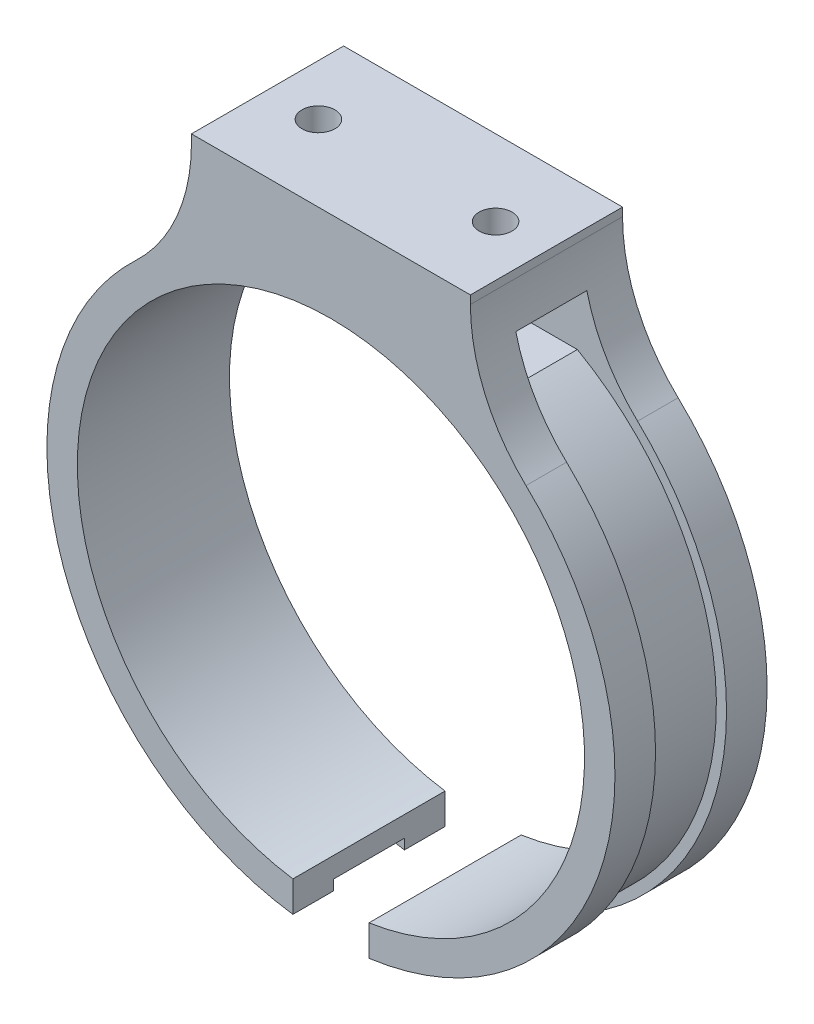
ISO-10303-21;
HEADER;
FILE_DESCRIPTION(('STEP AP214'),'2;1');
FILE_NAME('part.step','',(''),(''),'','','');
FILE_SCHEMA(('AUTOMOTIVE_DESIGN { 1 0 10303 214 1 1 1 1 }'));
ENDSEC;
DATA;
#1=APPLICATION_CONTEXT('core data for automotive mechanical design processes');
#2=APPLICATION_PROTOCOL_DEFINITION('international standard','automotive_design',2000,#1);
#3=PRODUCT_CONTEXT('',#1,'mechanical');
#4=PRODUCT('Part','Part','',(#3));
#5=PRODUCT_RELATED_PRODUCT_CATEGORY('part','',(#4));
#6=PRODUCT_DEFINITION_FORMATION('','',#4);
#7=PRODUCT_DEFINITION_CONTEXT('part definition',#1,'design');
#8=PRODUCT_DEFINITION('design','',#6,#7);
#9=PRODUCT_DEFINITION_SHAPE('','',#8);
#10=(LENGTH_UNIT() NAMED_UNIT(*) SI_UNIT(.MILLI.,.METRE.));
#11=(NAMED_UNIT(*) PLANE_ANGLE_UNIT() SI_UNIT($,.RADIAN.));
#12=(NAMED_UNIT(*) SI_UNIT($,.STERADIAN.) SOLID_ANGLE_UNIT());
#13=UNCERTAINTY_MEASURE_WITH_UNIT(LENGTH_MEASURE(1.E-05),#10,'distance_accuracy_value','');
#14=(GEOMETRIC_REPRESENTATION_CONTEXT(3) GLOBAL_UNCERTAINTY_ASSIGNED_CONTEXT((#13)) GLOBAL_UNIT_ASSIGNED_CONTEXT((#10,
#11,#12)) REPRESENTATION_CONTEXT('',''));
#15=CARTESIAN_POINT('',(0.,0.,0.));
#16=DIRECTION('',(0.,0.,1.));
#17=DIRECTION('',(1.,0.,0.));
#18=AXIS2_PLACEMENT_3D('',#15,#16,#17);
#19=CARTESIAN_POINT('',(0.,0.,-7.));
#20=DIRECTION('',(0.,0.,1.));
#21=DIRECTION('',(1.,0.,0.));
#22=AXIS2_PLACEMENT_3D('',#19,#20,#21);
#23=CYLINDRICAL_SURFACE('',#22,54.);
#24=DIRECTION('',(0.,0.,1.));
#25=VECTOR('',#24,1.);
#26=CARTESIAN_POINT('',(26.5894716006167,47.,-7.));
#27=LINE('',#26,#25);
#28=CARTESIAN_POINT('',(26.5894716006167,47.,7.));
#29=VERTEX_POINT('',#28);
#30=CARTESIAN_POINT('',(26.5894716006167,47.,-7.));
#31=VERTEX_POINT('',#30);
#32=EDGE_CURVE('E11',#29,#31,#27,.F.);
#33=ORIENTED_EDGE('',*,*,#32,.F.);
#34=CARTESIAN_POINT('',(0.,0.,7.));
#35=DIRECTION('',(0.,0.,1.));
#36=DIRECTION('',(1.,0.,0.));
#37=AXIS2_PLACEMENT_3D('',#34,#35,#36);
#38=CIRCLE('',#37,54.);
#39=CARTESIAN_POINT('',(7.5,-53.4766304099277,7.));
#40=VERTEX_POINT('',#39);
#41=EDGE_CURVE('E275',#40,#29,#38,.T.);
#42=ORIENTED_EDGE('',*,*,#41,.F.);
#43=DIRECTION('',(0.,0.,1.));
#44=VECTOR('',#43,1.);
#45=CARTESIAN_POINT('',(7.5,-53.4766304099277,-7.));
#46=LINE('',#45,#44);
#47=CARTESIAN_POINT('',(7.5,-53.4766304099277,-7.));
#48=VERTEX_POINT('',#47);
#49=EDGE_CURVE('E342',#48,#40,#46,.T.);
#50=ORIENTED_EDGE('',*,*,#49,.F.);
#51=CARTESIAN_POINT('',(0.,0.,-7.));
#52=DIRECTION('',(0.,0.,1.));
#53=DIRECTION('',(1.,0.,0.));
#54=AXIS2_PLACEMENT_3D('',#51,#52,#53);
#55=CIRCLE('',#54,54.);
#56=EDGE_CURVE('E270',#48,#31,#55,.T.);
#57=ORIENTED_EDGE('',*,*,#56,.T.);
#58=EDGE_LOOP('',(#33,#42,#50,#57));
#59=FACE_BOUND('',#58,.T.);
#60=ADVANCED_FACE('F35',(#59),#23,.T.);
#61=CARTESIAN_POINT('',(0.,0.,15.));
#62=DIRECTION('',(0.,0.,-1.));
#63=DIRECTION('',(-1.,0.,0.));
#64=AXIS2_PLACEMENT_3D('',#61,#62,#63);
#65=CYLINDRICAL_SURFACE('',#64,56.);
#66=CARTESIAN_POINT('',(0.,0.,-15.));
#67=DIRECTION('',(0.,0.,1.));
#68=DIRECTION('',(1.,0.,0.));
#69=AXIS2_PLACEMENT_3D('',#66,#67,#68);
#70=CIRCLE('',#69,56.);
#71=CARTESIAN_POINT('',(-38.4615384615385,40.7027033398471,-15.));
#72=VERTEX_POINT('',#71);
#73=CARTESIAN_POINT('',(-7.5,-55.4954953126828,-15.));
#74=VERTEX_POINT('',#73);
#75=EDGE_CURVE('E319',#72,#74,#70,.T.);
#76=ORIENTED_EDGE('',*,*,#75,.T.);
#77=DIRECTION('',(0.,0.,-1.));
#78=VECTOR('',#77,1.);
#79=CARTESIAN_POINT('',(-7.5,-55.4954953126828,15.));
#80=LINE('',#79,#78);
#81=CARTESIAN_POINT('',(-7.5,-55.4954953126828,-7.));
#82=VERTEX_POINT('',#81);
#83=EDGE_CURVE('E258',#74,#82,#80,.F.);
#84=ORIENTED_EDGE('',*,*,#83,.T.);
#85=CARTESIAN_POINT('',(0.,0.,-7.));
#86=DIRECTION('',(0.,0.,1.));
#87=DIRECTION('',(1.,0.,0.));
#88=AXIS2_PLACEMENT_3D('',#85,#86,#87);
#89=CIRCLE('',#88,56.);
#90=CARTESIAN_POINT('',(-38.4615384615385,40.7027033398471,-7.));
#91=VERTEX_POINT('',#90);
#92=EDGE_CURVE('E281',#91,#82,#89,.T.);
#93=ORIENTED_EDGE('',*,*,#92,.F.);
#94=DIRECTION('',(0.,0.,-1.));
#95=VECTOR('',#94,1.);
#96=CARTESIAN_POINT('',(-38.4615384615385,40.7027033398471,15.));
#97=LINE('',#96,#95);
#98=EDGE_CURVE('E324',#91,#72,#97,.T.);
#99=ORIENTED_EDGE('',*,*,#98,.T.);
#100=EDGE_LOOP('',(#76,#84,#93,#99));
#101=FACE_BOUND('',#100,.T.);
#102=ADVANCED_FACE('F369',(#101),#65,.T.);
#103=CARTESIAN_POINT('',(0.,0.,7.));
#104=DIRECTION('',(0.,0.,1.));
#105=DIRECTION('',(1.,0.,0.));
#106=AXIS2_PLACEMENT_3D('',#103,#104,#105);
#107=CIRCLE('',#106,56.);
#108=CARTESIAN_POINT('',(-38.4615384615385,40.7027033398471,7.));
#109=VERTEX_POINT('',#108);
#110=CARTESIAN_POINT('',(-7.5,-55.4954953126828,7.));
#111=VERTEX_POINT('',#110);
#112=EDGE_CURVE('E191',#109,#111,#107,.T.);
#113=ORIENTED_EDGE('',*,*,#112,.T.);
#114=DIRECTION('',(0.,0.,-1.));
#115=VECTOR('',#114,1.);
#116=CARTESIAN_POINT('',(-7.5,-55.4954953126828,15.));
#117=LINE('',#116,#115);
#118=CARTESIAN_POINT('',(-7.5,-55.4954953126828,15.));
#119=VERTEX_POINT('',#118);
#120=EDGE_CURVE('E255',#111,#119,#117,.F.);
#121=ORIENTED_EDGE('',*,*,#120,.T.);
#122=CARTESIAN_POINT('',(0.,0.,15.));
#123=DIRECTION('',(0.,0.,1.));
#124=DIRECTION('',(1.,0.,0.));
#125=AXIS2_PLACEMENT_3D('',#122,#123,#124);
#126=CIRCLE('',#125,56.);
#127=CARTESIAN_POINT('',(-38.4615384615385,40.7027033398471,15.));
#128=VERTEX_POINT('',#127);
#129=EDGE_CURVE('E314',#128,#119,#126,.T.);
#130=ORIENTED_EDGE('',*,*,#129,.F.);
#131=EDGE_CURVE('E325',#128,#109,#97,.T.);
#132=ORIENTED_EDGE('',*,*,#131,.T.);
#133=EDGE_LOOP('',(#113,#121,#130,#132));
#134=FACE_BOUND('',#133,.T.);
#135=ADVANCED_FACE('F390',(#134),#65,.T.);
#136=CARTESIAN_POINT('',(7.5,-55.4954953126828,-7.));
#137=VERTEX_POINT('',#136);
#138=CARTESIAN_POINT('',(38.4615384615385,40.7027033398471,-7.));
#139=VERTEX_POINT('',#138);
#140=EDGE_CURVE('E280',#137,#139,#89,.T.);
#141=ORIENTED_EDGE('',*,*,#140,.F.);
#142=DIRECTION('',(0.,0.,-1.));
#143=VECTOR('',#142,1.);
#144=CARTESIAN_POINT('',(7.5,-55.4954953126828,15.));
#145=LINE('',#144,#143);
#146=CARTESIAN_POINT('',(7.5,-55.4954953126828,-15.));
#147=VERTEX_POINT('',#146);
#148=EDGE_CURVE('E246',#137,#147,#145,.T.);
#149=ORIENTED_EDGE('',*,*,#148,.T.);
#150=CARTESIAN_POINT('',(38.4615384615385,40.7027033398471,-15.));
#151=VERTEX_POINT('',#150);
#152=EDGE_CURVE('E311',#147,#151,#70,.T.);
#153=ORIENTED_EDGE('',*,*,#152,.T.);
#154=DIRECTION('',(0.,0.,-1.));
#155=VECTOR('',#154,1.);
#156=CARTESIAN_POINT('',(38.4615384615385,40.7027033398471,15.));
#157=LINE('',#156,#155);
#158=EDGE_CURVE('E328',#151,#139,#157,.F.);
#159=ORIENTED_EDGE('',*,*,#158,.T.);
#160=EDGE_LOOP('',(#141,#149,#153,#159));
#161=FACE_BOUND('',#160,.T.);
#162=ADVANCED_FACE('F413',(#161),#65,.T.);
#163=CARTESIAN_POINT('',(62.5,66.1418929272515,15.));
#164=DIRECTION('',(0.,0.,-1.));
#165=DIRECTION('',(-1.,0.,0.));
#166=AXIS2_PLACEMENT_3D('',#163,#164,#165);
#167=CYLINDRICAL_SURFACE('',#166,35.);
#168=CARTESIAN_POINT('',(62.5,66.1418929272515,7.));
#169=DIRECTION('',(0.,0.,1.));
#170=DIRECTION('',(1.,0.,0.));
#171=AXIS2_PLACEMENT_3D('',#168,#169,#170);
#172=CIRCLE('',#171,35.);
#173=CARTESIAN_POINT('',(38.4615384615385,40.7027033398471,7.));
#174=VERTEX_POINT('',#173);
#175=CARTESIAN_POINT('',(28.4601765638955,58.,7.));
#176=VERTEX_POINT('',#175);
#177=EDGE_CURVE('E278',#174,#176,#172,.F.);
#178=ORIENTED_EDGE('',*,*,#177,.T.);
#179=DIRECTION('',(0.,0.,-1.));
#180=VECTOR('',#179,1.);
#181=CARTESIAN_POINT('',(28.4601765638955,58.,15.));
#182=LINE('',#181,#180);
#183=CARTESIAN_POINT('',(28.4601765638955,58.,-7.));
#184=VERTEX_POINT('',#183);
#185=EDGE_CURVE('E207',#176,#184,#182,.T.);
#186=ORIENTED_EDGE('',*,*,#185,.T.);
#187=CARTESIAN_POINT('',(62.5,66.1418929272515,-7.));
#188=DIRECTION('',(0.,0.,1.));
#189=DIRECTION('',(1.,0.,0.));
#190=AXIS2_PLACEMENT_3D('',#187,#188,#189);
#191=CIRCLE('',#190,35.);
#192=EDGE_CURVE('E284',#139,#184,#191,.F.);
#193=ORIENTED_EDGE('',*,*,#192,.F.);
#194=ORIENTED_EDGE('',*,*,#158,.F.);
#195=CARTESIAN_POINT('',(62.5,66.1418929272515,-15.));
#196=DIRECTION('',(0.,0.,1.));
#197=DIRECTION('',(1.,0.,0.));
#198=AXIS2_PLACEMENT_3D('',#195,#196,#197);
#199=CIRCLE('',#198,35.);
#200=CARTESIAN_POINT('',(27.5,66.1418929272515,-15.));
#201=VERTEX_POINT('',#200);
#202=EDGE_CURVE('E333',#201,#151,#199,.T.);
#203=ORIENTED_EDGE('',*,*,#202,.F.);
#204=DIRECTION('',(0.,0.,1.));
#205=VECTOR('',#204,1.);
#206=CARTESIAN_POINT('',(27.5,66.1418929272515,-15.));
#207=LINE('',#206,#205);
#208=CARTESIAN_POINT('',(27.5,66.1418929272515,15.));
#209=VERTEX_POINT('',#208);
#210=EDGE_CURVE('E317',#209,#201,#207,.F.);
#211=ORIENTED_EDGE('',*,*,#210,.F.);
#212=CARTESIAN_POINT('',(62.5,66.1418929272515,15.));
#213=DIRECTION('',(0.,0.,1.));
#214=DIRECTION('',(1.,0.,0.));
#215=AXIS2_PLACEMENT_3D('',#212,#213,#214);
#216=CIRCLE('',#215,35.);
#217=CARTESIAN_POINT('',(38.4615384615385,40.7027033398471,15.));
#218=VERTEX_POINT('',#217);
#219=EDGE_CURVE('E336',#218,#209,#216,.F.);
#220=ORIENTED_EDGE('',*,*,#219,.F.);
#221=EDGE_CURVE('E327',#174,#218,#157,.F.);
#222=ORIENTED_EDGE('',*,*,#221,.F.);
#223=EDGE_LOOP('',(#178,#186,#193,#194,#203,#211,#220,#222));
#224=FACE_BOUND('',#223,.T.);
#225=ADVANCED_FACE('F406',(#224),#167,.F.);
#226=CARTESIAN_POINT('',(-62.5,66.1418929272515,15.));
#227=DIRECTION('',(0.,0.,-1.));
#228=DIRECTION('',(-1.,0.,0.));
#229=AXIS2_PLACEMENT_3D('',#226,#227,#228);
#230=CYLINDRICAL_SURFACE('',#229,35.);
#231=DIRECTION('',(0.,0.,-1.));
#232=VECTOR('',#231,1.);
#233=CARTESIAN_POINT('',(-28.4601765638955,58.,15.));
#234=LINE('',#233,#232);
#235=CARTESIAN_POINT('',(-28.4601765638955,58.,-7.));
#236=VERTEX_POINT('',#235);
#237=CARTESIAN_POINT('',(-28.4601765638955,58.,7.));
#238=VERTEX_POINT('',#237);
#239=EDGE_CURVE('E205',#236,#238,#234,.F.);
#240=ORIENTED_EDGE('',*,*,#239,.T.);
#241=CARTESIAN_POINT('',(-62.5,66.1418929272515,7.));
#242=DIRECTION('',(0.,0.,1.));
#243=DIRECTION('',(1.,0.,0.));
#244=AXIS2_PLACEMENT_3D('',#241,#242,#243);
#245=CIRCLE('',#244,35.);
#246=EDGE_CURVE('E183',#238,#109,#245,.F.);
#247=ORIENTED_EDGE('',*,*,#246,.T.);
#248=ORIENTED_EDGE('',*,*,#131,.F.);
#249=CARTESIAN_POINT('',(-62.5,66.1418929272515,15.));
#250=DIRECTION('',(0.,0.,1.));
#251=DIRECTION('',(1.,0.,0.));
#252=AXIS2_PLACEMENT_3D('',#249,#250,#251);
#253=CIRCLE('',#252,35.);
#254=CARTESIAN_POINT('',(-27.5,66.1418929272515,15.));
#255=VERTEX_POINT('',#254);
#256=EDGE_CURVE('E197',#255,#128,#253,.F.);
#257=ORIENTED_EDGE('',*,*,#256,.F.);
#258=DIRECTION('',(0.,0.,1.));
#259=VECTOR('',#258,1.);
#260=CARTESIAN_POINT('',(-27.5,66.1418929272515,15.));
#261=LINE('',#260,#259);
#262=CARTESIAN_POINT('',(-27.5,66.1418929272515,-15.));
#263=VERTEX_POINT('',#262);
#264=EDGE_CURVE('E331',#263,#255,#261,.T.);
#265=ORIENTED_EDGE('',*,*,#264,.F.);
#266=CARTESIAN_POINT('',(-62.5,66.1418929272515,-15.));
#267=DIRECTION('',(0.,0.,1.));
#268=DIRECTION('',(1.,0.,0.));
#269=AXIS2_PLACEMENT_3D('',#266,#267,#268);
#270=CIRCLE('',#269,35.);
#271=EDGE_CURVE('E338',#72,#263,#270,.T.);
#272=ORIENTED_EDGE('',*,*,#271,.F.);
#273=ORIENTED_EDGE('',*,*,#98,.F.);
#274=CARTESIAN_POINT('',(-62.5,66.1418929272515,-7.));
#275=DIRECTION('',(0.,0.,1.));
#276=DIRECTION('',(1.,0.,0.));
#277=AXIS2_PLACEMENT_3D('',#274,#275,#276);
#278=CIRCLE('',#277,35.);
#279=EDGE_CURVE('E196',#236,#91,#278,.F.);
#280=ORIENTED_EDGE('',*,*,#279,.F.);
#281=EDGE_LOOP('',(#240,#247,#248,#257,#265,#272,#273,#280));
#282=FACE_BOUND('',#281,.T.);
#283=ADVANCED_FACE('F37',(#282),#230,.F.);
#284=CARTESIAN_POINT('',(7.5,-55.4954953126828,15.));
#285=VERTEX_POINT('',#284);
#286=EDGE_CURVE('E318',#285,#218,#126,.T.);
#287=ORIENTED_EDGE('',*,*,#286,.F.);
#288=DIRECTION('',(0.,0.,-1.));
#289=VECTOR('',#288,1.);
#290=CARTESIAN_POINT('',(7.5,-55.4954953126828,15.));
#291=LINE('',#290,#289);
#292=CARTESIAN_POINT('',(7.5,-55.4954953126828,7.));
#293=VERTEX_POINT('',#292);
#294=EDGE_CURVE('E243',#285,#293,#291,.T.);
#295=ORIENTED_EDGE('',*,*,#294,.T.);
#296=EDGE_CURVE('E273',#293,#174,#107,.T.);
#297=ORIENTED_EDGE('',*,*,#296,.T.);
#298=ORIENTED_EDGE('',*,*,#221,.T.);
#299=EDGE_LOOP('',(#287,#295,#297,#298));
#300=FACE_BOUND('',#299,.T.);
#301=ADVANCED_FACE('F425',(#300),#65,.T.);
#302=CARTESIAN_POINT('',(0.,0.,15.));
#303=DIRECTION('',(0.,0.,1.));
#304=DIRECTION('',(1.,0.,0.));
#305=AXIS2_PLACEMENT_3D('',#302,#303,#304);
#306=PLANE('',#305);
#307=DIRECTION('',(0.,1.,0.));
#308=VECTOR('',#307,1.);
#309=CARTESIAN_POINT('',(-7.5,-56.,15.));
#310=LINE('',#309,#308);
#311=CARTESIAN_POINT('',(-7.5,-49.434299833213,15.));
#312=VERTEX_POINT('',#311);
#313=EDGE_CURVE('E228',#119,#312,#310,.T.);
#314=ORIENTED_EDGE('',*,*,#313,.T.);
#315=CARTESIAN_POINT('',(0.,0.,15.));
#316=DIRECTION('',(0.,0.,1.));
#317=DIRECTION('',(1.,0.,0.));
#318=AXIS2_PLACEMENT_3D('',#315,#316,#317);
#319=CIRCLE('',#318,50.);
#320=CARTESIAN_POINT('',(7.5,-49.434299833213,15.));
#321=VERTEX_POINT('',#320);
#322=EDGE_CURVE('E308',#321,#312,#319,.T.);
#323=ORIENTED_EDGE('',*,*,#322,.F.);
#324=DIRECTION('',(0.,1.,0.));
#325=VECTOR('',#324,1.);
#326=CARTESIAN_POINT('',(7.5,-56.,15.));
#327=LINE('',#326,#325);
#328=EDGE_CURVE('E235',#285,#321,#327,.T.);
#329=ORIENTED_EDGE('',*,*,#328,.F.);
#330=ORIENTED_EDGE('',*,*,#286,.T.);
#331=ORIENTED_EDGE('',*,*,#219,.T.);
#332=DIRECTION('',(0.,1.,0.));
#333=VECTOR('',#332,1.);
#334=CARTESIAN_POINT('',(27.5,67.7826813531196,15.));
#335=LINE('',#334,#333);
#336=CARTESIAN_POINT('',(27.5,67.7826813531196,15.));
#337=VERTEX_POINT('',#336);
#338=EDGE_CURVE('E302',#209,#337,#335,.T.);
#339=ORIENTED_EDGE('',*,*,#338,.T.);
#340=DIRECTION('',(-1.,0.,0.));
#341=VECTOR('',#340,1.);
#342=CARTESIAN_POINT('',(27.5,67.7826813531196,15.));
#343=LINE('',#342,#341);
#344=CARTESIAN_POINT('',(-27.5,67.7826813531196,15.));
#345=VERTEX_POINT('',#344);
#346=EDGE_CURVE('E299',#337,#345,#343,.T.);
#347=ORIENTED_EDGE('',*,*,#346,.T.);
#348=DIRECTION('',(0.,-1.,0.));
#349=VECTOR('',#348,1.);
#350=CARTESIAN_POINT('',(-27.5,48.7826813531196,15.));
#351=LINE('',#350,#349);
#352=EDGE_CURVE('E295',#345,#255,#351,.T.);
#353=ORIENTED_EDGE('',*,*,#352,.T.);
#354=ORIENTED_EDGE('',*,*,#256,.T.);
#355=ORIENTED_EDGE('',*,*,#129,.T.);
#356=EDGE_LOOP('',(#314,#323,#329,#330,#331,#339,#347,#353,#354,#355));
#357=FACE_BOUND('',#356,.T.);
#358=ADVANCED_FACE('F386',(#357),#306,.T.);
#359=CARTESIAN_POINT('',(0.,0.,-15.));
#360=DIRECTION('',(0.,0.,1.));
#361=DIRECTION('',(1.,0.,0.));
#362=AXIS2_PLACEMENT_3D('',#359,#360,#361);
#363=PLANE('',#362);
#364=CARTESIAN_POINT('',(0.,0.,-15.));
#365=DIRECTION('',(0.,0.,1.));
#366=DIRECTION('',(1.,0.,0.));
#367=AXIS2_PLACEMENT_3D('',#364,#365,#366);
#368=CIRCLE('',#367,50.);
#369=CARTESIAN_POINT('',(7.5,-49.434299833213,-15.));
#370=VERTEX_POINT('',#369);
#371=CARTESIAN_POINT('',(-7.5,-49.434299833213,-15.));
#372=VERTEX_POINT('',#371);
#373=EDGE_CURVE('E298',#370,#372,#368,.T.);
#374=ORIENTED_EDGE('',*,*,#373,.T.);
#375=DIRECTION('',(0.,1.,0.));
#376=VECTOR('',#375,1.);
#377=CARTESIAN_POINT('',(-7.5,-56.,-15.));
#378=LINE('',#377,#376);
#379=EDGE_CURVE('E229',#74,#372,#378,.T.);
#380=ORIENTED_EDGE('',*,*,#379,.F.);
#381=ORIENTED_EDGE('',*,*,#75,.F.);
#382=ORIENTED_EDGE('',*,*,#271,.T.);
#383=DIRECTION('',(0.,1.,0.));
#384=VECTOR('',#383,1.);
#385=CARTESIAN_POINT('',(-27.5,48.7826813531196,-15.));
#386=LINE('',#385,#384);
#387=CARTESIAN_POINT('',(-27.5,67.7826813531196,-15.));
#388=VERTEX_POINT('',#387);
#389=EDGE_CURVE('E292',#263,#388,#386,.T.);
#390=ORIENTED_EDGE('',*,*,#389,.T.);
#391=DIRECTION('',(1.,0.,0.));
#392=VECTOR('',#391,1.);
#393=CARTESIAN_POINT('',(27.5,67.7826813531196,-15.));
#394=LINE('',#393,#392);
#395=CARTESIAN_POINT('',(27.5,67.7826813531196,-15.));
#396=VERTEX_POINT('',#395);
#397=EDGE_CURVE('E289',#388,#396,#394,.T.);
#398=ORIENTED_EDGE('',*,*,#397,.T.);
#399=DIRECTION('',(0.,-1.,0.));
#400=VECTOR('',#399,1.);
#401=CARTESIAN_POINT('',(27.5,67.7826813531196,-15.));
#402=LINE('',#401,#400);
#403=EDGE_CURVE('E286',#396,#201,#402,.T.);
#404=ORIENTED_EDGE('',*,*,#403,.T.);
#405=ORIENTED_EDGE('',*,*,#202,.T.);
#406=ORIENTED_EDGE('',*,*,#152,.F.);
#407=DIRECTION('',(0.,1.,0.));
#408=VECTOR('',#407,1.);
#409=CARTESIAN_POINT('',(7.5,-56.,-15.));
#410=LINE('',#409,#408);
#411=EDGE_CURVE('E232',#147,#370,#410,.T.);
#412=ORIENTED_EDGE('',*,*,#411,.T.);
#413=EDGE_LOOP('',(#374,#380,#381,#382,#390,#398,#404,#405,#406,#412));
#414=FACE_BOUND('',#413,.T.);
#415=ADVANCED_FACE('F377',(#414),#363,.F.);
#416=CARTESIAN_POINT('',(0.,0.,15.));
#417=DIRECTION('',(0.,0.,-1.));
#418=DIRECTION('',(-1.,0.,0.));
#419=AXIS2_PLACEMENT_3D('',#416,#417,#418);
#420=CYLINDRICAL_SURFACE('',#419,50.);
#421=DIRECTION('',(0.,0.,-1.));
#422=VECTOR('',#421,1.);
#423=CARTESIAN_POINT('',(-17.058722109232,47.,15.));
#424=LINE('',#423,#422);
#425=CARTESIAN_POINT('',(-17.058722109232,47.,7.));
#426=VERTEX_POINT('',#425);
#427=CARTESIAN_POINT('',(-17.058722109232,47.,-7.));
#428=VERTEX_POINT('',#427);
#429=EDGE_CURVE('E222',#426,#428,#424,.T.);
#430=ORIENTED_EDGE('',*,*,#429,.F.);
#431=CARTESIAN_POINT('',(0.,0.,6.99999999999999));
#432=DIRECTION('',(0.,0.,1.));
#433=DIRECTION('',(0.,-1.,0.));
#434=AXIS2_PLACEMENT_3D('',#431,#432,#433);
#435=CIRCLE('',#434,50.);
#436=CARTESIAN_POINT('',(17.058722109232,47.,7.));
#437=VERTEX_POINT('',#436);
#438=EDGE_CURVE('E226',#437,#426,#435,.T.);
#439=ORIENTED_EDGE('',*,*,#438,.F.);
#440=DIRECTION('',(0.,0.,-1.));
#441=VECTOR('',#440,1.);
#442=CARTESIAN_POINT('',(17.058722109232,47.,15.));
#443=LINE('',#442,#441);
#444=CARTESIAN_POINT('',(17.058722109232,47.,-7.));
#445=VERTEX_POINT('',#444);
#446=EDGE_CURVE('E215',#445,#437,#443,.F.);
#447=ORIENTED_EDGE('',*,*,#446,.F.);
#448=CARTESIAN_POINT('',(0.,0.,-7.00000000000001));
#449=DIRECTION('',(0.,0.,-1.));
#450=DIRECTION('',(0.,1.,0.));
#451=AXIS2_PLACEMENT_3D('',#448,#449,#450);
#452=CIRCLE('',#451,50.);
#453=EDGE_CURVE('E224',#428,#445,#452,.T.);
#454=ORIENTED_EDGE('',*,*,#453,.F.);
#455=EDGE_LOOP('',(#430,#439,#447,#454));
#456=FACE_BOUND('',#455,.T.);
#457=DIRECTION('',(0.,0.,-1.));
#458=VECTOR('',#457,1.);
#459=CARTESIAN_POINT('',(-7.5,-49.434299833213,15.));
#460=LINE('',#459,#458);
#461=EDGE_CURVE('E261',#372,#312,#460,.F.);
#462=ORIENTED_EDGE('',*,*,#461,.F.);
#463=ORIENTED_EDGE('',*,*,#373,.F.);
#464=DIRECTION('',(0.,0.,-1.));
#465=VECTOR('',#464,1.);
#466=CARTESIAN_POINT('',(7.5,-49.434299833213,15.));
#467=LINE('',#466,#465);
#468=EDGE_CURVE('E249',#321,#370,#467,.T.);
#469=ORIENTED_EDGE('',*,*,#468,.F.);
#470=ORIENTED_EDGE('',*,*,#322,.T.);
#471=EDGE_LOOP('',(#462,#463,#469,#470));
#472=FACE_BOUND('',#471,.T.);
#473=ADVANCED_FACE('F381',(#456,#472),#420,.F.);
#474=CARTESIAN_POINT('',(27.5,67.7826813531196,73.1893461039046));
#475=DIRECTION('',(0.,-1.,0.));
#476=DIRECTION('',(1.,0.,0.));
#477=AXIS2_PLACEMENT_3D('',#474,#475,#476);
#478=PLANE('',#477);
#479=CARTESIAN_POINT('',(-17.4625,67.7826813531196,0.));
#480=DIRECTION('',(0.,1.,0.));
#481=DIRECTION('',(0.,0.,1.));
#482=AXIS2_PLACEMENT_3D('',#479,#480,#481);
#483=CIRCLE('',#482,3.25);
#484=CARTESIAN_POINT('',(-17.4625,67.7826813531196,3.25));
#485=VERTEX_POINT('',#484);
#486=EDGE_CURVE('E264',#485,#485,#483,.T.);
#487=ORIENTED_EDGE('',*,*,#486,.F.);
#488=EDGE_LOOP('',(#487));
#489=FACE_BOUND('',#488,.T.);
#490=CARTESIAN_POINT('',(17.4625,67.7826813531196,0.));
#491=DIRECTION('',(0.,1.,0.));
#492=DIRECTION('',(0.,0.,1.));
#493=AXIS2_PLACEMENT_3D('',#490,#491,#492);
#494=CIRCLE('',#493,3.25);
#495=CARTESIAN_POINT('',(17.4625,67.7826813531196,3.25));
#496=VERTEX_POINT('',#495);
#497=EDGE_CURVE('E263',#496,#496,#494,.T.);
#498=ORIENTED_EDGE('',*,*,#497,.F.);
#499=EDGE_LOOP('',(#498));
#500=FACE_BOUND('',#499,.T.);
#501=ORIENTED_EDGE('',*,*,#346,.F.);
#502=DIRECTION('',(0.,0.,-1.));
#503=VECTOR('',#502,1.);
#504=CARTESIAN_POINT('',(27.5,67.7826813531196,73.1893461039046));
#505=LINE('',#504,#503);
#506=EDGE_CURVE('E294',#337,#396,#505,.T.);
#507=ORIENTED_EDGE('',*,*,#506,.T.);
#508=ORIENTED_EDGE('',*,*,#397,.F.);
#509=DIRECTION('',(0.,0.,-1.));
#510=VECTOR('',#509,1.);
#511=CARTESIAN_POINT('',(-27.5,67.7826813531196,73.1893461039046));
#512=LINE('',#511,#510);
#513=EDGE_CURVE('E304',#345,#388,#512,.T.);
#514=ORIENTED_EDGE('',*,*,#513,.F.);
#515=EDGE_LOOP('',(#501,#507,#508,#514));
#516=FACE_BOUND('',#515,.T.);
#517=ADVANCED_FACE('F397',(#489,#500,#516),#478,.F.);
#518=CARTESIAN_POINT('',(-27.5,48.7826813531196,73.1893461039046));
#519=DIRECTION('',(1.,0.,0.));
#520=DIRECTION('',(0.,0.,-1.));
#521=AXIS2_PLACEMENT_3D('',#518,#519,#520);
#522=PLANE('',#521);
#523=ORIENTED_EDGE('',*,*,#389,.F.);
#524=ORIENTED_EDGE('',*,*,#264,.T.);
#525=ORIENTED_EDGE('',*,*,#352,.F.);
#526=ORIENTED_EDGE('',*,*,#513,.T.);
#527=EDGE_LOOP('',(#523,#524,#525,#526));
#528=FACE_BOUND('',#527,.T.);
#529=ADVANCED_FACE('F394',(#528),#522,.F.);
#530=CARTESIAN_POINT('',(27.5,67.7826813531196,73.1893461039046));
#531=DIRECTION('',(-1.,0.,0.));
#532=DIRECTION('',(0.,-1.,0.));
#533=AXIS2_PLACEMENT_3D('',#530,#531,#532);
#534=PLANE('',#533);
#535=ORIENTED_EDGE('',*,*,#338,.F.);
#536=ORIENTED_EDGE('',*,*,#210,.T.);
#537=ORIENTED_EDGE('',*,*,#403,.F.);
#538=ORIENTED_EDGE('',*,*,#506,.F.);
#539=EDGE_LOOP('',(#535,#536,#537,#538));
#540=FACE_BOUND('',#539,.T.);
#541=ADVANCED_FACE('F402',(#540),#534,.F.);
#542=CARTESIAN_POINT('',(0.,0.,-7.));
#543=DIRECTION('',(0.,0.,1.));
#544=DIRECTION('',(1.,0.,0.));
#545=AXIS2_PLACEMENT_3D('',#542,#543,#544);
#546=PLANE('',#545);
#547=ORIENTED_EDGE('',*,*,#192,.T.);
#548=DIRECTION('',(1.,0.,0.));
#549=VECTOR('',#548,1.);
#550=CARTESIAN_POINT('',(-56.,58.,-7.));
#551=LINE('',#550,#549);
#552=EDGE_CURVE('E209',#236,#184,#551,.T.);
#553=ORIENTED_EDGE('',*,*,#552,.F.);
#554=ORIENTED_EDGE('',*,*,#279,.T.);
#555=ORIENTED_EDGE('',*,*,#92,.T.);
#556=DIRECTION('',(0.,-1.,0.));
#557=VECTOR('',#556,1.);
#558=CARTESIAN_POINT('',(-7.5,0.,-7.));
#559=LINE('',#558,#557);
#560=CARTESIAN_POINT('',(-7.5,-53.4766304099277,-7.));
#561=VERTEX_POINT('',#560);
#562=EDGE_CURVE('E253',#561,#82,#559,.T.);
#563=ORIENTED_EDGE('',*,*,#562,.F.);
#564=CARTESIAN_POINT('',(-26.5894716006167,47.,-7.));
#565=VERTEX_POINT('',#564);
#566=EDGE_CURVE('E274',#565,#561,#55,.T.);
#567=ORIENTED_EDGE('',*,*,#566,.F.);
#568=DIRECTION('',(1.,0.,0.));
#569=VECTOR('',#568,1.);
#570=CARTESIAN_POINT('',(-56.,47.,-7.));
#571=LINE('',#570,#569);
#572=EDGE_CURVE('E57',#565,#428,#571,.T.);
#573=ORIENTED_EDGE('',*,*,#572,.T.);
#574=ORIENTED_EDGE('',*,*,#453,.T.);
#575=EDGE_CURVE('E49',#445,#31,#571,.T.);
#576=ORIENTED_EDGE('',*,*,#575,.T.);
#577=ORIENTED_EDGE('',*,*,#56,.F.);
#578=DIRECTION('',(0.,1.,0.));
#579=VECTOR('',#578,1.);
#580=CARTESIAN_POINT('',(7.5,0.,-7.));
#581=LINE('',#580,#579);
#582=EDGE_CURVE('E241',#137,#48,#581,.T.);
#583=ORIENTED_EDGE('',*,*,#582,.F.);
#584=ORIENTED_EDGE('',*,*,#140,.T.);
#585=EDGE_LOOP('',(#547,#553,#554,#555,#563,#567,#573,#574,#576,#577,#583,#584));
#586=FACE_BOUND('',#585,.T.);
#587=ADVANCED_FACE('F366',(#586),#546,.T.);
#588=CARTESIAN_POINT('',(0.,0.,7.));
#589=DIRECTION('',(0.,0.,1.));
#590=DIRECTION('',(1.,0.,0.));
#591=AXIS2_PLACEMENT_3D('',#588,#589,#590);
#592=PLANE('',#591);
#593=ORIENTED_EDGE('',*,*,#41,.T.);
#594=DIRECTION('',(1.,0.,0.));
#595=VECTOR('',#594,1.);
#596=CARTESIAN_POINT('',(-56.,47.,7.));
#597=LINE('',#596,#595);
#598=EDGE_CURVE('E359',#437,#29,#597,.T.);
#599=ORIENTED_EDGE('',*,*,#598,.F.);
#600=ORIENTED_EDGE('',*,*,#438,.T.);
#601=CARTESIAN_POINT('',(-26.5894716006167,47.,7.));
#602=VERTEX_POINT('',#601);
#603=EDGE_CURVE('E351',#602,#426,#597,.T.);
#604=ORIENTED_EDGE('',*,*,#603,.F.);
#605=CARTESIAN_POINT('',(-7.5,-53.4766304099277,7.));
#606=VERTEX_POINT('',#605);
#607=EDGE_CURVE('E267',#602,#606,#38,.T.);
#608=ORIENTED_EDGE('',*,*,#607,.T.);
#609=DIRECTION('',(0.,-1.,0.));
#610=VECTOR('',#609,1.);
#611=CARTESIAN_POINT('',(-7.5,0.,7.));
#612=LINE('',#611,#610);
#613=EDGE_CURVE('E251',#606,#111,#612,.T.);
#614=ORIENTED_EDGE('',*,*,#613,.T.);
#615=ORIENTED_EDGE('',*,*,#112,.F.);
#616=ORIENTED_EDGE('',*,*,#246,.F.);
#617=DIRECTION('',(1.,0.,0.));
#618=VECTOR('',#617,1.);
#619=CARTESIAN_POINT('',(-56.,58.,7.));
#620=LINE('',#619,#618);
#621=EDGE_CURVE('E188',#238,#176,#620,.T.);
#622=ORIENTED_EDGE('',*,*,#621,.T.);
#623=ORIENTED_EDGE('',*,*,#177,.F.);
#624=ORIENTED_EDGE('',*,*,#296,.F.);
#625=DIRECTION('',(0.,1.,0.));
#626=VECTOR('',#625,1.);
#627=CARTESIAN_POINT('',(7.5,0.,7.));
#628=LINE('',#627,#626);
#629=EDGE_CURVE('E231',#293,#40,#628,.T.);
#630=ORIENTED_EDGE('',*,*,#629,.T.);
#631=EDGE_LOOP('',(#593,#599,#600,#604,#608,#614,#615,#616,#622,#623,#624,#630));
#632=FACE_BOUND('',#631,.T.);
#633=ADVANCED_FACE('F186',(#632),#592,.F.);
#634=DIRECTION('',(0.,0.,1.));
#635=VECTOR('',#634,1.);
#636=CARTESIAN_POINT('',(-26.5894716006167,47.,-7.));
#637=LINE('',#636,#635);
#638=EDGE_CURVE('E43',#565,#602,#637,.T.);
#639=ORIENTED_EDGE('',*,*,#638,.F.);
#640=ORIENTED_EDGE('',*,*,#566,.T.);
#641=DIRECTION('',(0.,0.,1.));
#642=VECTOR('',#641,1.);
#643=CARTESIAN_POINT('',(-7.5,-53.4766304099277,-7.));
#644=LINE('',#643,#642);
#645=EDGE_CURVE('E344',#606,#561,#644,.F.);
#646=ORIENTED_EDGE('',*,*,#645,.F.);
#647=ORIENTED_EDGE('',*,*,#607,.F.);
#648=EDGE_LOOP('',(#639,#640,#646,#647));
#649=FACE_BOUND('',#648,.T.);
#650=ADVANCED_FACE('F361',(#649),#23,.T.);
#651=CARTESIAN_POINT('',(17.4625,-56.001,0.));
#652=DIRECTION('',(0.,1.,0.));
#653=DIRECTION('',(0.,0.,1.));
#654=AXIS2_PLACEMENT_3D('',#651,#652,#653);
#655=CYLINDRICAL_SURFACE('',#654,3.25);
#656=CARTESIAN_POINT('',(17.4625,58.,0.));
#657=DIRECTION('',(0.,1.,0.));
#658=DIRECTION('',(0.,0.,1.));
#659=AXIS2_PLACEMENT_3D('',#656,#657,#658);
#660=CIRCLE('',#659,3.25);
#661=CARTESIAN_POINT('',(17.4625,58.,3.25));
#662=VERTEX_POINT('',#661);
#663=EDGE_CURVE('E213',#662,#662,#660,.F.);
#664=ORIENTED_EDGE('',*,*,#663,.T.);
#665=EDGE_LOOP('',(#664));
#666=FACE_BOUND('',#665,.T.);
#667=ORIENTED_EDGE('',*,*,#497,.T.);
#668=EDGE_LOOP('',(#667));
#669=FACE_BOUND('',#668,.T.);
#670=ADVANCED_FACE('F451',(#666,#669),#655,.F.);
#671=CARTESIAN_POINT('',(-17.4625,-56.001,0.));
#672=DIRECTION('',(0.,1.,0.));
#673=DIRECTION('',(0.,0.,1.));
#674=AXIS2_PLACEMENT_3D('',#671,#672,#673);
#675=CYLINDRICAL_SURFACE('',#674,3.25);
#676=CARTESIAN_POINT('',(-17.4625,58.,0.));
#677=DIRECTION('',(0.,1.,0.));
#678=DIRECTION('',(0.,0.,1.));
#679=AXIS2_PLACEMENT_3D('',#676,#677,#678);
#680=CIRCLE('',#679,3.25);
#681=CARTESIAN_POINT('',(-17.4625,58.,3.25));
#682=VERTEX_POINT('',#681);
#683=EDGE_CURVE('E208',#682,#682,#680,.F.);
#684=ORIENTED_EDGE('',*,*,#683,.T.);
#685=EDGE_LOOP('',(#684));
#686=FACE_BOUND('',#685,.T.);
#687=ORIENTED_EDGE('',*,*,#486,.T.);
#688=EDGE_LOOP('',(#687));
#689=FACE_BOUND('',#688,.T.);
#690=ADVANCED_FACE('F456',(#686,#689),#675,.F.);
#691=CARTESIAN_POINT('',(7.5,-56.,15.));
#692=DIRECTION('',(1.,0.,0.));
#693=DIRECTION('',(0.,0.,-1.));
#694=AXIS2_PLACEMENT_3D('',#691,#692,#693);
#695=PLANE('',#694);
#696=ORIENTED_EDGE('',*,*,#468,.T.);
#697=ORIENTED_EDGE('',*,*,#411,.F.);
#698=ORIENTED_EDGE('',*,*,#148,.F.);
#699=ORIENTED_EDGE('',*,*,#582,.T.);
#700=ORIENTED_EDGE('',*,*,#49,.T.);
#701=ORIENTED_EDGE('',*,*,#629,.F.);
#702=ORIENTED_EDGE('',*,*,#294,.F.);
#703=ORIENTED_EDGE('',*,*,#328,.T.);
#704=EDGE_LOOP('',(#696,#697,#698,#699,#700,#701,#702,#703));
#705=FACE_BOUND('',#704,.T.);
#706=ADVANCED_FACE('F416',(#705),#695,.F.);
#707=CARTESIAN_POINT('',(-7.5,-56.,15.));
#708=DIRECTION('',(-1.,0.,0.));
#709=DIRECTION('',(0.,0.,1.));
#710=AXIS2_PLACEMENT_3D('',#707,#708,#709);
#711=PLANE('',#710);
#712=ORIENTED_EDGE('',*,*,#461,.T.);
#713=ORIENTED_EDGE('',*,*,#313,.F.);
#714=ORIENTED_EDGE('',*,*,#120,.F.);
#715=ORIENTED_EDGE('',*,*,#613,.F.);
#716=ORIENTED_EDGE('',*,*,#645,.T.);
#717=ORIENTED_EDGE('',*,*,#562,.T.);
#718=ORIENTED_EDGE('',*,*,#83,.F.);
#719=ORIENTED_EDGE('',*,*,#379,.T.);
#720=EDGE_LOOP('',(#712,#713,#714,#715,#716,#717,#718,#719));
#721=FACE_BOUND('',#720,.T.);
#722=ADVANCED_FACE('F364',(#721),#711,.F.);
#723=CARTESIAN_POINT('',(-56.,58.,7.));
#724=DIRECTION('',(0.,1.,0.));
#725=DIRECTION('',(0.,0.,1.));
#726=AXIS2_PLACEMENT_3D('',#723,#724,#725);
#727=PLANE('',#726);
#728=ORIENTED_EDGE('',*,*,#663,.F.);
#729=EDGE_LOOP('',(#728));
#730=FACE_BOUND('',#729,.T.);
#731=ORIENTED_EDGE('',*,*,#621,.F.);
#732=ORIENTED_EDGE('',*,*,#239,.F.);
#733=ORIENTED_EDGE('',*,*,#552,.T.);
#734=ORIENTED_EDGE('',*,*,#185,.F.);
#735=EDGE_LOOP('',(#731,#732,#733,#734));
#736=FACE_BOUND('',#735,.T.);
#737=ORIENTED_EDGE('',*,*,#683,.F.);
#738=EDGE_LOOP('',(#737));
#739=FACE_BOUND('',#738,.T.);
#740=ADVANCED_FACE('F202',(#730,#736,#739),#727,.F.);
#741=CARTESIAN_POINT('',(-56.,47.,7.));
#742=DIRECTION('',(0.,-1.,0.));
#743=DIRECTION('',(0.,0.,-1.));
#744=AXIS2_PLACEMENT_3D('',#741,#742,#743);
#745=PLANE('',#744);
#746=ORIENTED_EDGE('',*,*,#429,.T.);
#747=ORIENTED_EDGE('',*,*,#572,.F.);
#748=ORIENTED_EDGE('',*,*,#638,.T.);
#749=ORIENTED_EDGE('',*,*,#603,.T.);
#750=EDGE_LOOP('',(#746,#747,#748,#749));
#751=FACE_BOUND('',#750,.T.);
#752=ADVANCED_FACE('F350',(#751),#745,.F.);
#753=ORIENTED_EDGE('',*,*,#446,.T.);
#754=ORIENTED_EDGE('',*,*,#598,.T.);
#755=ORIENTED_EDGE('',*,*,#32,.T.);
#756=ORIENTED_EDGE('',*,*,#575,.F.);
#757=EDGE_LOOP('',(#753,#754,#755,#756));
#758=FACE_BOUND('',#757,.T.);
#759=ADVANCED_FACE('F428',(#758),#745,.F.);
#760=CLOSED_SHELL('',(#60,#102,#135,#162,#225,#283,#301,#358,#415,#473,#517,#529,#541,#587,#633,
#650,#670,#690,#706,#722,#740,#752,#759));
#761=MANIFOLD_SOLID_BREP('B2',#760);
#762=ADVANCED_BREP_SHAPE_REPRESENTATION('',(#18,#761),#14);
#763=SHAPE_DEFINITION_REPRESENTATION(#9,#762);
ENDSEC;
END-ISO-10303-21;
